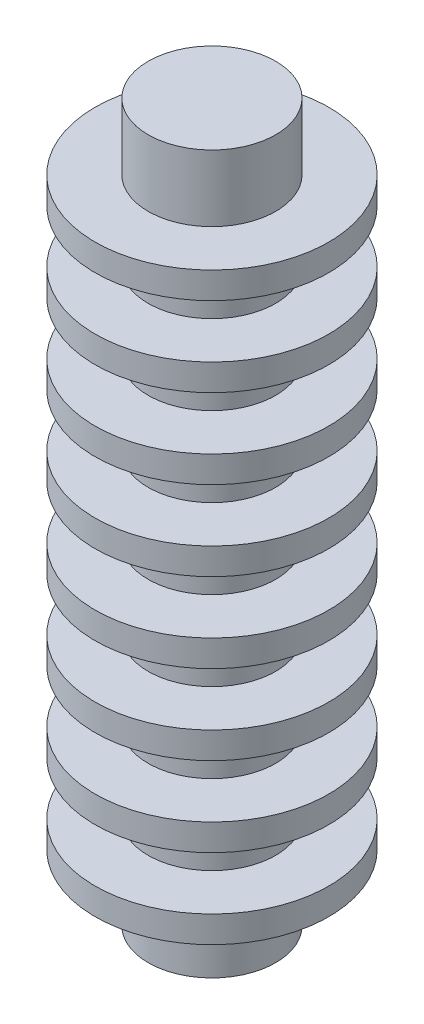
ISO-10303-21;
HEADER;
FILE_DESCRIPTION(('STEP AP214'),'2;1');
FILE_NAME('part.step','',(''),(''),'','','');
FILE_SCHEMA(('AUTOMOTIVE_DESIGN { 1 0 10303 214 1 1 1 1 }'));
ENDSEC;
DATA;
#1=APPLICATION_CONTEXT('core data for automotive mechanical design processes');
#2=APPLICATION_PROTOCOL_DEFINITION('international standard','automotive_design',2000,#1);
#3=PRODUCT_CONTEXT('',#1,'mechanical');
#4=PRODUCT('Part','Part','',(#3));
#5=PRODUCT_RELATED_PRODUCT_CATEGORY('part','',(#4));
#6=PRODUCT_DEFINITION_FORMATION('','',#4);
#7=PRODUCT_DEFINITION_CONTEXT('part definition',#1,'design');
#8=PRODUCT_DEFINITION('design','',#6,#7);
#9=PRODUCT_DEFINITION_SHAPE('','',#8);
#10=(LENGTH_UNIT() NAMED_UNIT(*) SI_UNIT(.MILLI.,.METRE.));
#11=(NAMED_UNIT(*) PLANE_ANGLE_UNIT() SI_UNIT($,.RADIAN.));
#12=(NAMED_UNIT(*) SI_UNIT($,.STERADIAN.) SOLID_ANGLE_UNIT());
#13=UNCERTAINTY_MEASURE_WITH_UNIT(LENGTH_MEASURE(1.E-05),#10,'distance_accuracy_value','');
#14=(GEOMETRIC_REPRESENTATION_CONTEXT(3) GLOBAL_UNCERTAINTY_ASSIGNED_CONTEXT((#13)) GLOBAL_UNIT_ASSIGNED_CONTEXT((#10,
#11,#12)) REPRESENTATION_CONTEXT('',''));
#15=CARTESIAN_POINT('',(0.,0.,0.));
#16=DIRECTION('',(0.,0.,1.));
#17=DIRECTION('',(1.,0.,0.));
#18=AXIS2_PLACEMENT_3D('',#15,#16,#17);
#19=CARTESIAN_POINT('',(4.8,27.,0.));
#20=DIRECTION('',(0.,-1.,0.));
#21=DIRECTION('',(1.,0.,0.));
#22=AXIS2_PLACEMENT_3D('',#19,#20,#21);
#23=PLANE('',#22);
#24=CARTESIAN_POINT('',(0.,27.,0.));
#25=DIRECTION('',(0.,1.,0.));
#26=DIRECTION('',(-1.,0.,0.));
#27=AXIS2_PLACEMENT_3D('',#24,#25,#26);
#28=CIRCLE('',#27,4.79999999999999);
#29=CARTESIAN_POINT('',(-4.79999999999998,27.,0.));
#30=VERTEX_POINT('',#29);
#31=EDGE_CURVE('E10',#30,#30,#28,.T.);
#32=ORIENTED_EDGE('',*,*,#31,.T.);
#33=EDGE_LOOP('',(#32));
#34=FACE_BOUND('',#33,.T.);
#35=ADVANCED_FACE('F43',(#34),#23,.F.);
#36=CARTESIAN_POINT('',(0.,27.,0.));
#37=DIRECTION('',(0.,1.,0.));
#38=DIRECTION('',(-1.,0.,0.));
#39=AXIS2_PLACEMENT_3D('',#36,#37,#38);
#40=CYLINDRICAL_SURFACE('',#39,4.79999999999999);
#41=ORIENTED_EDGE('',*,*,#31,.F.);
#42=EDGE_LOOP('',(#41));
#43=FACE_BOUND('',#42,.T.);
#44=CARTESIAN_POINT('',(0.,22.,0.));
#45=DIRECTION('',(0.,1.,0.));
#46=DIRECTION('',(-1.,0.,0.));
#47=AXIS2_PLACEMENT_3D('',#44,#45,#46);
#48=CIRCLE('',#47,4.79999999999999);
#49=CARTESIAN_POINT('',(-4.79999999999998,22.,0.));
#50=VERTEX_POINT('',#49);
#51=EDGE_CURVE('E50',#50,#50,#48,.T.);
#52=ORIENTED_EDGE('',*,*,#51,.T.);
#53=EDGE_LOOP('',(#52));
#54=FACE_BOUND('',#53,.T.);
#55=ADVANCED_FACE('F199',(#43,#54),#40,.T.);
#56=CARTESIAN_POINT('',(4.8,22.,0.));
#57=DIRECTION('',(0.,-1.,0.));
#58=DIRECTION('',(1.,0.,0.));
#59=AXIS2_PLACEMENT_3D('',#56,#57,#58);
#60=PLANE('',#59);
#61=ORIENTED_EDGE('',*,*,#51,.F.);
#62=EDGE_LOOP('',(#61));
#63=FACE_BOUND('',#62,.T.);
#64=CARTESIAN_POINT('',(0.,22.,0.));
#65=DIRECTION('',(0.,1.,0.));
#66=DIRECTION('',(-1.,0.,0.));
#67=AXIS2_PLACEMENT_3D('',#64,#65,#66);
#68=CIRCLE('',#67,8.79999999999913);
#69=CARTESIAN_POINT('',(-8.79999999999912,22.,0.));
#70=VERTEX_POINT('',#69);
#71=EDGE_CURVE('E55',#70,#70,#68,.T.);
#72=ORIENTED_EDGE('',*,*,#71,.T.);
#73=EDGE_LOOP('',(#72));
#74=FACE_BOUND('',#73,.T.);
#75=ADVANCED_FACE('F203',(#63,#74),#60,.F.);
#76=CARTESIAN_POINT('',(0.,27.,0.));
#77=DIRECTION('',(0.,1.,0.));
#78=DIRECTION('',(-1.,0.,0.));
#79=AXIS2_PLACEMENT_3D('',#76,#77,#78);
#80=CYLINDRICAL_SURFACE('',#79,8.79999999999913);
#81=ORIENTED_EDGE('',*,*,#71,.F.);
#82=EDGE_LOOP('',(#81));
#83=FACE_BOUND('',#82,.T.);
#84=CARTESIAN_POINT('',(0.,20.,0.));
#85=DIRECTION('',(0.,1.,0.));
#86=DIRECTION('',(-1.,0.,0.));
#87=AXIS2_PLACEMENT_3D('',#84,#85,#86);
#88=CIRCLE('',#87,8.79999999999913);
#89=CARTESIAN_POINT('',(-8.79999999999912,20.,0.));
#90=VERTEX_POINT('',#89);
#91=EDGE_CURVE('E60',#90,#90,#88,.T.);
#92=ORIENTED_EDGE('',*,*,#91,.T.);
#93=EDGE_LOOP('',(#92));
#94=FACE_BOUND('',#93,.T.);
#95=ADVANCED_FACE('F208',(#83,#94),#80,.T.);
#96=CARTESIAN_POINT('',(8.79999999999914,20.0000000278243,0.));
#97=DIRECTION('',(0.,1.,0.));
#98=DIRECTION('',(-1.,0.,0.));
#99=AXIS2_PLACEMENT_3D('',#96,#97,#98);
#100=PLANE('',#99);
#101=ORIENTED_EDGE('',*,*,#91,.F.);
#102=EDGE_LOOP('',(#101));
#103=FACE_BOUND('',#102,.T.);
#104=CARTESIAN_POINT('',(0.,20.0000000556486,0.));
#105=DIRECTION('',(0.,1.,0.));
#106=DIRECTION('',(-1.,0.,0.));
#107=AXIS2_PLACEMENT_3D('',#104,#105,#106);
#108=CIRCLE('',#107,4.79999999999999);
#109=CARTESIAN_POINT('',(-4.79999999999998,20.0000000556486,0.));
#110=VERTEX_POINT('',#109);
#111=EDGE_CURVE('E66',#110,#110,#108,.T.);
#112=ORIENTED_EDGE('',*,*,#111,.T.);
#113=EDGE_LOOP('',(#112));
#114=FACE_BOUND('',#113,.T.);
#115=ADVANCED_FACE('F214',(#103,#114),#100,.F.);
#116=CARTESIAN_POINT('',(0.,27.,0.));
#117=DIRECTION('',(0.,1.,0.));
#118=DIRECTION('',(-1.,0.,0.));
#119=AXIS2_PLACEMENT_3D('',#116,#117,#118);
#120=CYLINDRICAL_SURFACE('',#119,4.79999999999978);
#121=ORIENTED_EDGE('',*,*,#111,.F.);
#122=EDGE_LOOP('',(#121));
#123=FACE_BOUND('',#122,.T.);
#124=CARTESIAN_POINT('',(0.,16.,0.));
#125=DIRECTION('',(0.,1.,0.));
#126=DIRECTION('',(-1.,0.,0.));
#127=AXIS2_PLACEMENT_3D('',#124,#125,#126);
#128=CIRCLE('',#127,4.79999999999999);
#129=CARTESIAN_POINT('',(-4.79999999999998,16.,0.));
#130=VERTEX_POINT('',#129);
#131=EDGE_CURVE('E70',#130,#130,#128,.T.);
#132=ORIENTED_EDGE('',*,*,#131,.T.);
#133=EDGE_LOOP('',(#132));
#134=FACE_BOUND('',#133,.T.);
#135=ADVANCED_FACE('F218',(#123,#134),#120,.T.);
#136=CARTESIAN_POINT('',(4.8,16.,0.));
#137=DIRECTION('',(0.,-1.,0.));
#138=DIRECTION('',(1.,0.,0.));
#139=AXIS2_PLACEMENT_3D('',#136,#137,#138);
#140=PLANE('',#139);
#141=ORIENTED_EDGE('',*,*,#131,.F.);
#142=EDGE_LOOP('',(#141));
#143=FACE_BOUND('',#142,.T.);
#144=CARTESIAN_POINT('',(0.,16.,0.));
#145=DIRECTION('',(0.,1.,0.));
#146=DIRECTION('',(-1.,0.,0.));
#147=AXIS2_PLACEMENT_3D('',#144,#145,#146);
#148=CIRCLE('',#147,8.79999999999981);
#149=CARTESIAN_POINT('',(-8.7999999999998,16.,0.));
#150=VERTEX_POINT('',#149);
#151=EDGE_CURVE('E74',#150,#150,#148,.T.);
#152=ORIENTED_EDGE('',*,*,#151,.T.);
#153=EDGE_LOOP('',(#152));
#154=FACE_BOUND('',#153,.T.);
#155=ADVANCED_FACE('F222',(#143,#154),#140,.F.);
#156=CARTESIAN_POINT('',(0.,27.,0.));
#157=DIRECTION('',(0.,1.,0.));
#158=DIRECTION('',(-1.,0.,0.));
#159=AXIS2_PLACEMENT_3D('',#156,#157,#158);
#160=CYLINDRICAL_SURFACE('',#159,8.79999999999981);
#161=ORIENTED_EDGE('',*,*,#151,.F.);
#162=EDGE_LOOP('',(#161));
#163=FACE_BOUND('',#162,.T.);
#164=CARTESIAN_POINT('',(0.,14.,0.));
#165=DIRECTION('',(0.,1.,0.));
#166=DIRECTION('',(-1.,0.,0.));
#167=AXIS2_PLACEMENT_3D('',#164,#165,#166);
#168=CIRCLE('',#167,8.79999999999981);
#169=CARTESIAN_POINT('',(-8.7999999999998,14.,0.));
#170=VERTEX_POINT('',#169);
#171=EDGE_CURVE('E78',#170,#170,#168,.T.);
#172=ORIENTED_EDGE('',*,*,#171,.T.);
#173=EDGE_LOOP('',(#172));
#174=FACE_BOUND('',#173,.T.);
#175=ADVANCED_FACE('F226',(#163,#174),#160,.T.);
#176=CARTESIAN_POINT('',(8.79999999999982,14.,0.));
#177=DIRECTION('',(0.,1.,0.));
#178=DIRECTION('',(-1.,0.,0.));
#179=AXIS2_PLACEMENT_3D('',#176,#177,#178);
#180=PLANE('',#179);
#181=ORIENTED_EDGE('',*,*,#171,.F.);
#182=EDGE_LOOP('',(#181));
#183=FACE_BOUND('',#182,.T.);
#184=CARTESIAN_POINT('',(0.,14.,0.));
#185=DIRECTION('',(0.,1.,0.));
#186=DIRECTION('',(-1.,0.,0.));
#187=AXIS2_PLACEMENT_3D('',#184,#185,#186);
#188=CIRCLE('',#187,4.80000000000061);
#189=CARTESIAN_POINT('',(-4.8000000000006,14.,0.));
#190=VERTEX_POINT('',#189);
#191=EDGE_CURVE('E82',#190,#190,#188,.T.);
#192=ORIENTED_EDGE('',*,*,#191,.T.);
#193=EDGE_LOOP('',(#192));
#194=FACE_BOUND('',#193,.T.);
#195=ADVANCED_FACE('F230',(#183,#194),#180,.F.);
#196=CARTESIAN_POINT('',(0.,27.,0.));
#197=DIRECTION('',(0.,1.,0.));
#198=DIRECTION('',(-1.,0.,0.));
#199=AXIS2_PLACEMENT_3D('',#196,#197,#198);
#200=CYLINDRICAL_SURFACE('',#199,4.80000000000061);
#201=ORIENTED_EDGE('',*,*,#191,.F.);
#202=EDGE_LOOP('',(#201));
#203=FACE_BOUND('',#202,.T.);
#204=CARTESIAN_POINT('',(0.,9.99999999999998,0.));
#205=DIRECTION('',(0.,1.,0.));
#206=DIRECTION('',(-1.,0.,0.));
#207=AXIS2_PLACEMENT_3D('',#204,#205,#206);
#208=CIRCLE('',#207,4.80000000000061);
#209=CARTESIAN_POINT('',(-4.8000000000006,9.99999999999998,0.));
#210=VERTEX_POINT('',#209);
#211=EDGE_CURVE('E86',#210,#210,#208,.T.);
#212=ORIENTED_EDGE('',*,*,#211,.T.);
#213=EDGE_LOOP('',(#212));
#214=FACE_BOUND('',#213,.T.);
#215=ADVANCED_FACE('F234',(#203,#214),#200,.T.);
#216=CARTESIAN_POINT('',(4.80000000000062,9.99999999999999,0.));
#217=DIRECTION('',(0.,-1.,0.));
#218=DIRECTION('',(1.,0.,0.));
#219=AXIS2_PLACEMENT_3D('',#216,#217,#218);
#220=PLANE('',#219);
#221=ORIENTED_EDGE('',*,*,#211,.F.);
#222=EDGE_LOOP('',(#221));
#223=FACE_BOUND('',#222,.T.);
#224=CARTESIAN_POINT('',(0.,9.99999999999998,0.));
#225=DIRECTION('',(0.,1.,0.));
#226=DIRECTION('',(-1.,0.,0.));
#227=AXIS2_PLACEMENT_3D('',#224,#225,#226);
#228=CIRCLE('',#227,8.79999999999974);
#229=CARTESIAN_POINT('',(-8.79999999999973,9.99999999999999,0.));
#230=VERTEX_POINT('',#229);
#231=EDGE_CURVE('E90',#230,#230,#228,.T.);
#232=ORIENTED_EDGE('',*,*,#231,.T.);
#233=EDGE_LOOP('',(#232));
#234=FACE_BOUND('',#233,.T.);
#235=ADVANCED_FACE('F238',(#223,#234),#220,.F.);
#236=CARTESIAN_POINT('',(0.,27.,0.));
#237=DIRECTION('',(0.,1.,0.));
#238=DIRECTION('',(-1.,0.,0.));
#239=AXIS2_PLACEMENT_3D('',#236,#237,#238);
#240=CYLINDRICAL_SURFACE('',#239,8.79999999999974);
#241=ORIENTED_EDGE('',*,*,#231,.F.);
#242=EDGE_LOOP('',(#241));
#243=FACE_BOUND('',#242,.T.);
#244=CARTESIAN_POINT('',(0.,7.99999999999999,0.));
#245=DIRECTION('',(0.,1.,0.));
#246=DIRECTION('',(-1.,0.,0.));
#247=AXIS2_PLACEMENT_3D('',#244,#245,#246);
#248=CIRCLE('',#247,8.79999999999974);
#249=CARTESIAN_POINT('',(-8.79999999999973,7.99999999999999,0.));
#250=VERTEX_POINT('',#249);
#251=EDGE_CURVE('E94',#250,#250,#248,.T.);
#252=ORIENTED_EDGE('',*,*,#251,.T.);
#253=EDGE_LOOP('',(#252));
#254=FACE_BOUND('',#253,.T.);
#255=ADVANCED_FACE('F242',(#243,#254),#240,.T.);
#256=CARTESIAN_POINT('',(8.79999999999975,7.99999999999999,0.));
#257=DIRECTION('',(0.,1.,0.));
#258=DIRECTION('',(-1.,0.,0.));
#259=AXIS2_PLACEMENT_3D('',#256,#257,#258);
#260=PLANE('',#259);
#261=ORIENTED_EDGE('',*,*,#251,.F.);
#262=EDGE_LOOP('',(#261));
#263=FACE_BOUND('',#262,.T.);
#264=CARTESIAN_POINT('',(0.,7.99999999999999,0.));
#265=DIRECTION('',(0.,1.,0.));
#266=DIRECTION('',(-1.,0.,0.));
#267=AXIS2_PLACEMENT_3D('',#264,#265,#266);
#268=CIRCLE('',#267,4.80000000000055);
#269=CARTESIAN_POINT('',(-4.80000000000054,7.99999999999999,0.));
#270=VERTEX_POINT('',#269);
#271=EDGE_CURVE('E98',#270,#270,#268,.T.);
#272=ORIENTED_EDGE('',*,*,#271,.T.);
#273=EDGE_LOOP('',(#272));
#274=FACE_BOUND('',#273,.T.);
#275=ADVANCED_FACE('F246',(#263,#274),#260,.F.);
#276=CARTESIAN_POINT('',(0.,27.,0.));
#277=DIRECTION('',(0.,1.,0.));
#278=DIRECTION('',(-1.,0.,0.));
#279=AXIS2_PLACEMENT_3D('',#276,#277,#278);
#280=CYLINDRICAL_SURFACE('',#279,4.80000000000055);
#281=ORIENTED_EDGE('',*,*,#271,.F.);
#282=EDGE_LOOP('',(#281));
#283=FACE_BOUND('',#282,.T.);
#284=CARTESIAN_POINT('',(0.,3.99999999999999,0.));
#285=DIRECTION('',(0.,1.,0.));
#286=DIRECTION('',(-1.,0.,0.));
#287=AXIS2_PLACEMENT_3D('',#284,#285,#286);
#288=CIRCLE('',#287,4.80000000000055);
#289=CARTESIAN_POINT('',(-4.80000000000054,3.99999999999999,0.));
#290=VERTEX_POINT('',#289);
#291=EDGE_CURVE('E102',#290,#290,#288,.T.);
#292=ORIENTED_EDGE('',*,*,#291,.T.);
#293=EDGE_LOOP('',(#292));
#294=FACE_BOUND('',#293,.T.);
#295=ADVANCED_FACE('F250',(#283,#294),#280,.T.);
#296=CARTESIAN_POINT('',(4.80000000000055,3.99999999999999,0.));
#297=DIRECTION('',(0.,-1.,0.));
#298=DIRECTION('',(1.,0.,0.));
#299=AXIS2_PLACEMENT_3D('',#296,#297,#298);
#300=PLANE('',#299);
#301=ORIENTED_EDGE('',*,*,#291,.F.);
#302=EDGE_LOOP('',(#301));
#303=FACE_BOUND('',#302,.T.);
#304=CARTESIAN_POINT('',(0.,3.99999999999999,0.));
#305=DIRECTION('',(0.,1.,0.));
#306=DIRECTION('',(-1.,0.,0.));
#307=AXIS2_PLACEMENT_3D('',#304,#305,#306);
#308=CIRCLE('',#307,8.79999999999968);
#309=CARTESIAN_POINT('',(-8.79999999999967,3.99999999999999,0.));
#310=VERTEX_POINT('',#309);
#311=EDGE_CURVE('E106',#310,#310,#308,.T.);
#312=ORIENTED_EDGE('',*,*,#311,.T.);
#313=EDGE_LOOP('',(#312));
#314=FACE_BOUND('',#313,.T.);
#315=ADVANCED_FACE('F254',(#303,#314),#300,.F.);
#316=CARTESIAN_POINT('',(0.,27.,0.));
#317=DIRECTION('',(0.,1.,0.));
#318=DIRECTION('',(-1.,0.,0.));
#319=AXIS2_PLACEMENT_3D('',#316,#317,#318);
#320=CYLINDRICAL_SURFACE('',#319,8.79999999999968);
#321=ORIENTED_EDGE('',*,*,#311,.F.);
#322=EDGE_LOOP('',(#321));
#323=FACE_BOUND('',#322,.T.);
#324=CARTESIAN_POINT('',(0.,1.99999999999999,0.));
#325=DIRECTION('',(0.,1.,0.));
#326=DIRECTION('',(-1.,0.,0.));
#327=AXIS2_PLACEMENT_3D('',#324,#325,#326);
#328=CIRCLE('',#327,8.79999999999968);
#329=CARTESIAN_POINT('',(-8.79999999999967,1.99999999999999,0.));
#330=VERTEX_POINT('',#329);
#331=EDGE_CURVE('E110',#330,#330,#328,.T.);
#332=ORIENTED_EDGE('',*,*,#331,.T.);
#333=EDGE_LOOP('',(#332));
#334=FACE_BOUND('',#333,.T.);
#335=ADVANCED_FACE('F258',(#323,#334),#320,.T.);
#336=CARTESIAN_POINT('',(8.79999999999969,1.99999999999999,0.));
#337=DIRECTION('',(0.,1.,0.));
#338=DIRECTION('',(-1.,0.,0.));
#339=AXIS2_PLACEMENT_3D('',#336,#337,#338);
#340=PLANE('',#339);
#341=ORIENTED_EDGE('',*,*,#331,.F.);
#342=EDGE_LOOP('',(#341));
#343=FACE_BOUND('',#342,.T.);
#344=CARTESIAN_POINT('',(0.,1.99999999999999,0.));
#345=DIRECTION('',(0.,1.,0.));
#346=DIRECTION('',(-1.,0.,0.));
#347=AXIS2_PLACEMENT_3D('',#344,#345,#346);
#348=CIRCLE('',#347,4.80000000000048);
#349=CARTESIAN_POINT('',(-4.80000000000047,1.99999999999999,0.));
#350=VERTEX_POINT('',#349);
#351=EDGE_CURVE('E114',#350,#350,#348,.T.);
#352=ORIENTED_EDGE('',*,*,#351,.T.);
#353=EDGE_LOOP('',(#352));
#354=FACE_BOUND('',#353,.T.);
#355=ADVANCED_FACE('F262',(#343,#354),#340,.F.);
#356=CARTESIAN_POINT('',(0.,27.,0.));
#357=DIRECTION('',(0.,1.,0.));
#358=DIRECTION('',(-1.,0.,0.));
#359=AXIS2_PLACEMENT_3D('',#356,#357,#358);
#360=CYLINDRICAL_SURFACE('',#359,4.80000000000048);
#361=ORIENTED_EDGE('',*,*,#351,.F.);
#362=EDGE_LOOP('',(#361));
#363=FACE_BOUND('',#362,.T.);
#364=CARTESIAN_POINT('',(0.,-2.00000000000001,0.));
#365=DIRECTION('',(0.,1.,0.));
#366=DIRECTION('',(-1.,0.,0.));
#367=AXIS2_PLACEMENT_3D('',#364,#365,#366);
#368=CIRCLE('',#367,4.80000000000048);
#369=CARTESIAN_POINT('',(-4.80000000000048,-2.,0.));
#370=VERTEX_POINT('',#369);
#371=EDGE_CURVE('E118',#370,#370,#368,.T.);
#372=ORIENTED_EDGE('',*,*,#371,.T.);
#373=EDGE_LOOP('',(#372));
#374=FACE_BOUND('',#373,.T.);
#375=ADVANCED_FACE('F266',(#363,#374),#360,.T.);
#376=CARTESIAN_POINT('',(4.80000000000049,-2.00000000000001,0.));
#377=DIRECTION('',(0.,-1.,0.));
#378=DIRECTION('',(1.,0.,0.));
#379=AXIS2_PLACEMENT_3D('',#376,#377,#378);
#380=PLANE('',#379);
#381=ORIENTED_EDGE('',*,*,#371,.F.);
#382=EDGE_LOOP('',(#381));
#383=FACE_BOUND('',#382,.T.);
#384=CARTESIAN_POINT('',(0.,-2.00000000000001,0.));
#385=DIRECTION('',(0.,1.,0.));
#386=DIRECTION('',(-1.,0.,0.));
#387=AXIS2_PLACEMENT_3D('',#384,#385,#386);
#388=CIRCLE('',#387,8.79999999999962);
#389=CARTESIAN_POINT('',(-8.79999999999961,-2.,0.));
#390=VERTEX_POINT('',#389);
#391=EDGE_CURVE('E122',#390,#390,#388,.T.);
#392=ORIENTED_EDGE('',*,*,#391,.T.);
#393=EDGE_LOOP('',(#392));
#394=FACE_BOUND('',#393,.T.);
#395=ADVANCED_FACE('F270',(#383,#394),#380,.F.);
#396=CARTESIAN_POINT('',(0.,27.,0.));
#397=DIRECTION('',(0.,1.,0.));
#398=DIRECTION('',(-1.,0.,0.));
#399=AXIS2_PLACEMENT_3D('',#396,#397,#398);
#400=CYLINDRICAL_SURFACE('',#399,8.79999999999962);
#401=ORIENTED_EDGE('',*,*,#391,.F.);
#402=EDGE_LOOP('',(#401));
#403=FACE_BOUND('',#402,.T.);
#404=CARTESIAN_POINT('',(0.,-4.00000000000001,0.));
#405=DIRECTION('',(0.,1.,0.));
#406=DIRECTION('',(-1.,0.,0.));
#407=AXIS2_PLACEMENT_3D('',#404,#405,#406);
#408=CIRCLE('',#407,8.79999999999962);
#409=CARTESIAN_POINT('',(-8.79999999999961,-4.00000000000001,0.));
#410=VERTEX_POINT('',#409);
#411=EDGE_CURVE('E126',#410,#410,#408,.T.);
#412=ORIENTED_EDGE('',*,*,#411,.T.);
#413=EDGE_LOOP('',(#412));
#414=FACE_BOUND('',#413,.T.);
#415=ADVANCED_FACE('F274',(#403,#414),#400,.T.);
#416=CARTESIAN_POINT('',(8.79999999999962,-4.00000000000001,0.));
#417=DIRECTION('',(0.,1.,0.));
#418=DIRECTION('',(-1.,0.,0.));
#419=AXIS2_PLACEMENT_3D('',#416,#417,#418);
#420=PLANE('',#419);
#421=ORIENTED_EDGE('',*,*,#411,.F.);
#422=EDGE_LOOP('',(#421));
#423=FACE_BOUND('',#422,.T.);
#424=CARTESIAN_POINT('',(0.,-4.00000000000001,0.));
#425=DIRECTION('',(0.,1.,0.));
#426=DIRECTION('',(-1.,0.,0.));
#427=AXIS2_PLACEMENT_3D('',#424,#425,#426);
#428=CIRCLE('',#427,4.80000000000042);
#429=CARTESIAN_POINT('',(-4.80000000000041,-4.00000000000001,0.));
#430=VERTEX_POINT('',#429);
#431=EDGE_CURVE('E130',#430,#430,#428,.T.);
#432=ORIENTED_EDGE('',*,*,#431,.T.);
#433=EDGE_LOOP('',(#432));
#434=FACE_BOUND('',#433,.T.);
#435=ADVANCED_FACE('F278',(#423,#434),#420,.F.);
#436=CARTESIAN_POINT('',(0.,27.,0.));
#437=DIRECTION('',(0.,1.,0.));
#438=DIRECTION('',(-1.,0.,0.));
#439=AXIS2_PLACEMENT_3D('',#436,#437,#438);
#440=CYLINDRICAL_SURFACE('',#439,4.80000000000042);
#441=ORIENTED_EDGE('',*,*,#431,.F.);
#442=EDGE_LOOP('',(#441));
#443=FACE_BOUND('',#442,.T.);
#444=CARTESIAN_POINT('',(0.,-8.,0.));
#445=DIRECTION('',(0.,1.,0.));
#446=DIRECTION('',(-1.,0.,0.));
#447=AXIS2_PLACEMENT_3D('',#444,#445,#446);
#448=CIRCLE('',#447,4.80000000000042);
#449=CARTESIAN_POINT('',(-4.80000000000041,-8.,0.));
#450=VERTEX_POINT('',#449);
#451=EDGE_CURVE('E134',#450,#450,#448,.T.);
#452=ORIENTED_EDGE('',*,*,#451,.T.);
#453=EDGE_LOOP('',(#452));
#454=FACE_BOUND('',#453,.T.);
#455=ADVANCED_FACE('F282',(#443,#454),#440,.T.);
#456=CARTESIAN_POINT('',(4.80000000000042,-8.,0.));
#457=DIRECTION('',(0.,-1.,0.));
#458=DIRECTION('',(1.,0.,0.));
#459=AXIS2_PLACEMENT_3D('',#456,#457,#458);
#460=PLANE('',#459);
#461=ORIENTED_EDGE('',*,*,#451,.F.);
#462=EDGE_LOOP('',(#461));
#463=FACE_BOUND('',#462,.T.);
#464=CARTESIAN_POINT('',(0.,-8.,0.));
#465=DIRECTION('',(0.,1.,0.));
#466=DIRECTION('',(-1.,0.,0.));
#467=AXIS2_PLACEMENT_3D('',#464,#465,#466);
#468=CIRCLE('',#467,8.79999999999955);
#469=CARTESIAN_POINT('',(-8.79999999999955,-8.,0.));
#470=VERTEX_POINT('',#469);
#471=EDGE_CURVE('E138',#470,#470,#468,.T.);
#472=ORIENTED_EDGE('',*,*,#471,.T.);
#473=EDGE_LOOP('',(#472));
#474=FACE_BOUND('',#473,.T.);
#475=ADVANCED_FACE('F286',(#463,#474),#460,.F.);
#476=CARTESIAN_POINT('',(0.,27.,0.));
#477=DIRECTION('',(0.,1.,0.));
#478=DIRECTION('',(-1.,0.,0.));
#479=AXIS2_PLACEMENT_3D('',#476,#477,#478);
#480=CYLINDRICAL_SURFACE('',#479,8.79999999999955);
#481=ORIENTED_EDGE('',*,*,#471,.F.);
#482=EDGE_LOOP('',(#481));
#483=FACE_BOUND('',#482,.T.);
#484=CARTESIAN_POINT('',(0.,-10.,0.));
#485=DIRECTION('',(0.,1.,0.));
#486=DIRECTION('',(-1.,0.,0.));
#487=AXIS2_PLACEMENT_3D('',#484,#485,#486);
#488=CIRCLE('',#487,8.79999999999955);
#489=CARTESIAN_POINT('',(-8.79999999999955,-10.,0.));
#490=VERTEX_POINT('',#489);
#491=EDGE_CURVE('E142',#490,#490,#488,.T.);
#492=ORIENTED_EDGE('',*,*,#491,.T.);
#493=EDGE_LOOP('',(#492));
#494=FACE_BOUND('',#493,.T.);
#495=ADVANCED_FACE('F290',(#483,#494),#480,.T.);
#496=CARTESIAN_POINT('',(8.79999999999956,-10.,0.));
#497=DIRECTION('',(0.,1.,0.));
#498=DIRECTION('',(-1.,0.,0.));
#499=AXIS2_PLACEMENT_3D('',#496,#497,#498);
#500=PLANE('',#499);
#501=ORIENTED_EDGE('',*,*,#491,.F.);
#502=EDGE_LOOP('',(#501));
#503=FACE_BOUND('',#502,.T.);
#504=CARTESIAN_POINT('',(0.,-10.,0.));
#505=DIRECTION('',(0.,1.,0.));
#506=DIRECTION('',(-1.,0.,0.));
#507=AXIS2_PLACEMENT_3D('',#504,#505,#506);
#508=CIRCLE('',#507,4.80000000000036);
#509=CARTESIAN_POINT('',(-4.80000000000035,-10.,0.));
#510=VERTEX_POINT('',#509);
#511=EDGE_CURVE('E146',#510,#510,#508,.T.);
#512=ORIENTED_EDGE('',*,*,#511,.T.);
#513=EDGE_LOOP('',(#512));
#514=FACE_BOUND('',#513,.T.);
#515=ADVANCED_FACE('F294',(#503,#514),#500,.F.);
#516=CARTESIAN_POINT('',(0.,27.,0.));
#517=DIRECTION('',(0.,1.,0.));
#518=DIRECTION('',(-1.,0.,0.));
#519=AXIS2_PLACEMENT_3D('',#516,#517,#518);
#520=CYLINDRICAL_SURFACE('',#519,4.80000000000036);
#521=ORIENTED_EDGE('',*,*,#511,.F.);
#522=EDGE_LOOP('',(#521));
#523=FACE_BOUND('',#522,.T.);
#524=CARTESIAN_POINT('',(0.,-14.,0.));
#525=DIRECTION('',(0.,1.,0.));
#526=DIRECTION('',(-1.,0.,0.));
#527=AXIS2_PLACEMENT_3D('',#524,#525,#526);
#528=CIRCLE('',#527,4.80000000000036);
#529=CARTESIAN_POINT('',(-4.80000000000035,-14.,0.));
#530=VERTEX_POINT('',#529);
#531=EDGE_CURVE('E150',#530,#530,#528,.T.);
#532=ORIENTED_EDGE('',*,*,#531,.T.);
#533=EDGE_LOOP('',(#532));
#534=FACE_BOUND('',#533,.T.);
#535=ADVANCED_FACE('F298',(#523,#534),#520,.T.);
#536=CARTESIAN_POINT('',(4.80000000000036,-14.,0.));
#537=DIRECTION('',(0.,-1.,0.));
#538=DIRECTION('',(1.,0.,0.));
#539=AXIS2_PLACEMENT_3D('',#536,#537,#538);
#540=PLANE('',#539);
#541=ORIENTED_EDGE('',*,*,#531,.F.);
#542=EDGE_LOOP('',(#541));
#543=FACE_BOUND('',#542,.T.);
#544=CARTESIAN_POINT('',(0.,-14.,0.));
#545=DIRECTION('',(0.,1.,0.));
#546=DIRECTION('',(-1.,0.,0.));
#547=AXIS2_PLACEMENT_3D('',#544,#545,#546);
#548=CIRCLE('',#547,8.79999999999949);
#549=CARTESIAN_POINT('',(-8.79999999999949,-14.,0.));
#550=VERTEX_POINT('',#549);
#551=EDGE_CURVE('E154',#550,#550,#548,.T.);
#552=ORIENTED_EDGE('',*,*,#551,.T.);
#553=EDGE_LOOP('',(#552));
#554=FACE_BOUND('',#553,.T.);
#555=ADVANCED_FACE('F302',(#543,#554),#540,.F.);
#556=CARTESIAN_POINT('',(0.,27.,0.));
#557=DIRECTION('',(0.,1.,0.));
#558=DIRECTION('',(-1.,0.,0.));
#559=AXIS2_PLACEMENT_3D('',#556,#557,#558);
#560=CYLINDRICAL_SURFACE('',#559,8.79999999999949);
#561=ORIENTED_EDGE('',*,*,#551,.F.);
#562=EDGE_LOOP('',(#561));
#563=FACE_BOUND('',#562,.T.);
#564=CARTESIAN_POINT('',(0.,-16.,0.));
#565=DIRECTION('',(0.,1.,0.));
#566=DIRECTION('',(-1.,0.,0.));
#567=AXIS2_PLACEMENT_3D('',#564,#565,#566);
#568=CIRCLE('',#567,8.79999999999949);
#569=CARTESIAN_POINT('',(-8.79999999999949,-16.,0.));
#570=VERTEX_POINT('',#569);
#571=EDGE_CURVE('E158',#570,#570,#568,.T.);
#572=ORIENTED_EDGE('',*,*,#571,.T.);
#573=EDGE_LOOP('',(#572));
#574=FACE_BOUND('',#573,.T.);
#575=ADVANCED_FACE('F306',(#563,#574),#560,.T.);
#576=CARTESIAN_POINT('',(8.7999999999995,-16.,0.));
#577=DIRECTION('',(0.,1.,0.));
#578=DIRECTION('',(-1.,0.,0.));
#579=AXIS2_PLACEMENT_3D('',#576,#577,#578);
#580=PLANE('',#579);
#581=ORIENTED_EDGE('',*,*,#571,.F.);
#582=EDGE_LOOP('',(#581));
#583=FACE_BOUND('',#582,.T.);
#584=CARTESIAN_POINT('',(0.,-16.,0.));
#585=DIRECTION('',(0.,1.,0.));
#586=DIRECTION('',(-1.,0.,0.));
#587=AXIS2_PLACEMENT_3D('',#584,#585,#586);
#588=CIRCLE('',#587,4.80000000000029);
#589=CARTESIAN_POINT('',(-4.80000000000029,-16.,0.));
#590=VERTEX_POINT('',#589);
#591=EDGE_CURVE('E162',#590,#590,#588,.T.);
#592=ORIENTED_EDGE('',*,*,#591,.T.);
#593=EDGE_LOOP('',(#592));
#594=FACE_BOUND('',#593,.T.);
#595=ADVANCED_FACE('F310',(#583,#594),#580,.F.);
#596=CARTESIAN_POINT('',(0.,27.,0.));
#597=DIRECTION('',(0.,1.,0.));
#598=DIRECTION('',(-1.,0.,0.));
#599=AXIS2_PLACEMENT_3D('',#596,#597,#598);
#600=CYLINDRICAL_SURFACE('',#599,4.80000000000029);
#601=ORIENTED_EDGE('',*,*,#591,.F.);
#602=EDGE_LOOP('',(#601));
#603=FACE_BOUND('',#602,.T.);
#604=CARTESIAN_POINT('',(0.,-20.,0.));
#605=DIRECTION('',(0.,1.,0.));
#606=DIRECTION('',(-1.,0.,0.));
#607=AXIS2_PLACEMENT_3D('',#604,#605,#606);
#608=CIRCLE('',#607,4.80000000000029);
#609=CARTESIAN_POINT('',(-4.80000000000029,-20.,0.));
#610=VERTEX_POINT('',#609);
#611=EDGE_CURVE('E166',#610,#610,#608,.T.);
#612=ORIENTED_EDGE('',*,*,#611,.T.);
#613=EDGE_LOOP('',(#612));
#614=FACE_BOUND('',#613,.T.);
#615=ADVANCED_FACE('F314',(#603,#614),#600,.T.);
#616=CARTESIAN_POINT('',(4.8000000000003,-20.,0.));
#617=DIRECTION('',(0.,-1.,0.));
#618=DIRECTION('',(1.,0.,0.));
#619=AXIS2_PLACEMENT_3D('',#616,#617,#618);
#620=PLANE('',#619);
#621=ORIENTED_EDGE('',*,*,#611,.F.);
#622=EDGE_LOOP('',(#621));
#623=FACE_BOUND('',#622,.T.);
#624=CARTESIAN_POINT('',(0.,-20.,0.));
#625=DIRECTION('',(0.,1.,0.));
#626=DIRECTION('',(-1.,0.,0.));
#627=AXIS2_PLACEMENT_3D('',#624,#625,#626);
#628=CIRCLE('',#627,8.79999999999943);
#629=CARTESIAN_POINT('',(-8.79999999999943,-20.,0.));
#630=VERTEX_POINT('',#629);
#631=EDGE_CURVE('E170',#630,#630,#628,.T.);
#632=ORIENTED_EDGE('',*,*,#631,.T.);
#633=EDGE_LOOP('',(#632));
#634=FACE_BOUND('',#633,.T.);
#635=ADVANCED_FACE('F318',(#623,#634),#620,.F.);
#636=CARTESIAN_POINT('',(0.,27.,0.));
#637=DIRECTION('',(0.,1.,0.));
#638=DIRECTION('',(-1.,0.,0.));
#639=AXIS2_PLACEMENT_3D('',#636,#637,#638);
#640=CYLINDRICAL_SURFACE('',#639,8.79999999999943);
#641=ORIENTED_EDGE('',*,*,#631,.F.);
#642=EDGE_LOOP('',(#641));
#643=FACE_BOUND('',#642,.T.);
#644=CARTESIAN_POINT('',(0.,-22.,0.));
#645=DIRECTION('',(0.,1.,0.));
#646=DIRECTION('',(-1.,0.,0.));
#647=AXIS2_PLACEMENT_3D('',#644,#645,#646);
#648=CIRCLE('',#647,8.79999999999943);
#649=CARTESIAN_POINT('',(-8.79999999999943,-22.,0.));
#650=VERTEX_POINT('',#649);
#651=EDGE_CURVE('E174',#650,#650,#648,.T.);
#652=ORIENTED_EDGE('',*,*,#651,.T.);
#653=EDGE_LOOP('',(#652));
#654=FACE_BOUND('',#653,.T.);
#655=ADVANCED_FACE('F322',(#643,#654),#640,.T.);
#656=CARTESIAN_POINT('',(8.79999999999943,-22.,0.));
#657=DIRECTION('',(0.,1.,0.));
#658=DIRECTION('',(-1.,0.,0.));
#659=AXIS2_PLACEMENT_3D('',#656,#657,#658);
#660=PLANE('',#659);
#661=ORIENTED_EDGE('',*,*,#651,.F.);
#662=EDGE_LOOP('',(#661));
#663=FACE_BOUND('',#662,.T.);
#664=CARTESIAN_POINT('',(0.,-22.,0.));
#665=DIRECTION('',(0.,1.,0.));
#666=DIRECTION('',(-1.,0.,0.));
#667=AXIS2_PLACEMENT_3D('',#664,#665,#666);
#668=CIRCLE('',#667,4.80000000000029);
#669=CARTESIAN_POINT('',(-4.80000000000029,-22.,0.));
#670=VERTEX_POINT('',#669);
#671=EDGE_CURVE('E178',#670,#670,#668,.T.);
#672=ORIENTED_EDGE('',*,*,#671,.T.);
#673=EDGE_LOOP('',(#672));
#674=FACE_BOUND('',#673,.T.);
#675=ADVANCED_FACE('F195',(#663,#674),#660,.F.);
#676=CARTESIAN_POINT('',(0.,27.,0.));
#677=DIRECTION('',(0.,1.,0.));
#678=DIRECTION('',(-1.,0.,0.));
#679=AXIS2_PLACEMENT_3D('',#676,#677,#678);
#680=CYLINDRICAL_SURFACE('',#679,4.8);
#681=ORIENTED_EDGE('',*,*,#671,.F.);
#682=EDGE_LOOP('',(#681));
#683=FACE_BOUND('',#682,.T.);
#684=CARTESIAN_POINT('',(0.,-27.,0.));
#685=DIRECTION('',(0.,1.,0.));
#686=DIRECTION('',(-1.,0.,0.));
#687=AXIS2_PLACEMENT_3D('',#684,#685,#686);
#688=CIRCLE('',#687,4.8);
#689=CARTESIAN_POINT('',(-4.8,-27.,0.));
#690=VERTEX_POINT('',#689);
#691=EDGE_CURVE('E182',#690,#690,#688,.T.);
#692=ORIENTED_EDGE('',*,*,#691,.T.);
#693=EDGE_LOOP('',(#692));
#694=FACE_BOUND('',#693,.T.);
#695=ADVANCED_FACE('F187',(#683,#694),#680,.T.);
#696=CARTESIAN_POINT('',(4.80000000000001,-27.,0.));
#697=DIRECTION('',(0.,1.,0.));
#698=DIRECTION('',(-1.,0.,0.));
#699=AXIS2_PLACEMENT_3D('',#696,#697,#698);
#700=PLANE('',#699);
#701=ORIENTED_EDGE('',*,*,#691,.F.);
#702=EDGE_LOOP('',(#701));
#703=FACE_BOUND('',#702,.T.);
#704=ADVANCED_FACE('F189',(#703),#700,.F.);
#705=CLOSED_SHELL('',(#35,#55,#75,#95,#115,#135,#155,#175,#195,#215,#235,#255,#275,#295,#315,
#335,#355,#375,#395,#415,#435,#455,#475,#495,#515,#535,#555,#575,#595,#615,#635,#655,#675,#695,#704));
#706=MANIFOLD_SOLID_BREP('B2',#705);
#707=ADVANCED_BREP_SHAPE_REPRESENTATION('',(#18,#706),#14);
#708=SHAPE_DEFINITION_REPRESENTATION(#9,#707);
ENDSEC;
END-ISO-10303-21;
